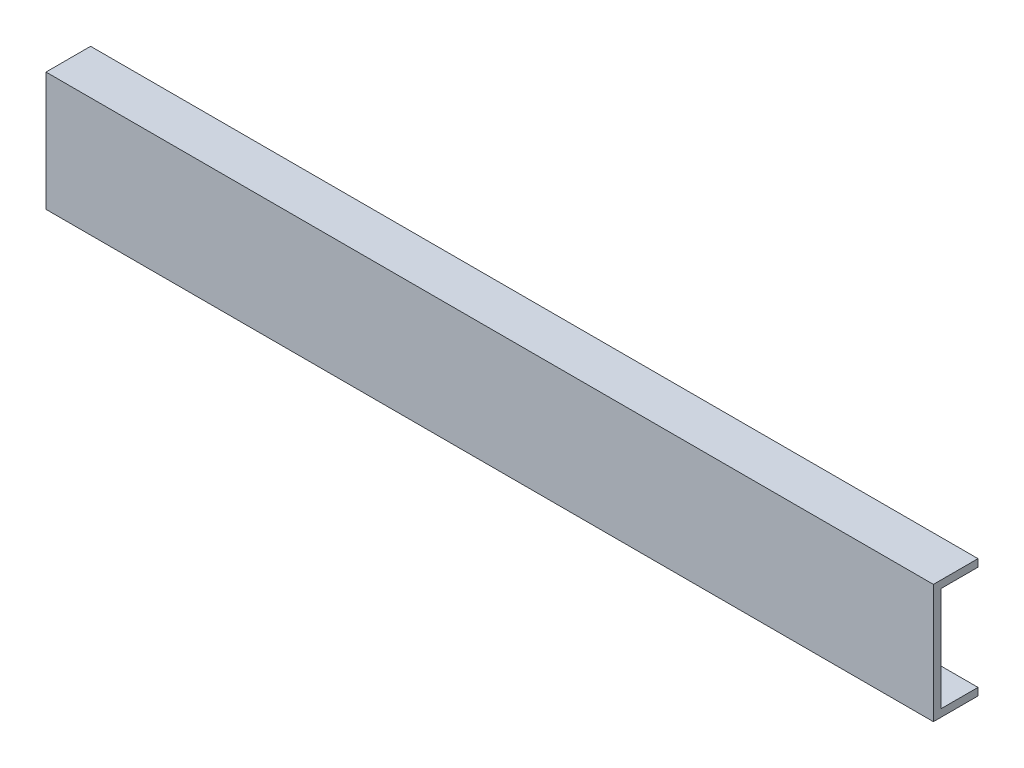
ISO-10303-21;
HEADER;
FILE_DESCRIPTION(('STEP AP214'),'2;1');
FILE_NAME('part.step','',(''),(''),'','','');
FILE_SCHEMA(('AUTOMOTIVE_DESIGN { 1 0 10303 214 1 1 1 1 }'));
ENDSEC;
DATA;
#1=APPLICATION_CONTEXT('core data for automotive mechanical design processes');
#2=APPLICATION_PROTOCOL_DEFINITION('international standard','automotive_design',2000,#1);
#3=PRODUCT_CONTEXT('',#1,'mechanical');
#4=PRODUCT('Part','Part','',(#3));
#5=PRODUCT_RELATED_PRODUCT_CATEGORY('part','',(#4));
#6=PRODUCT_DEFINITION_FORMATION('','',#4);
#7=PRODUCT_DEFINITION_CONTEXT('part definition',#1,'design');
#8=PRODUCT_DEFINITION('design','',#6,#7);
#9=PRODUCT_DEFINITION_SHAPE('','',#8);
#10=(LENGTH_UNIT() NAMED_UNIT(*) SI_UNIT(.MILLI.,.METRE.));
#11=(NAMED_UNIT(*) PLANE_ANGLE_UNIT() SI_UNIT($,.RADIAN.));
#12=(NAMED_UNIT(*) SI_UNIT($,.STERADIAN.) SOLID_ANGLE_UNIT());
#13=UNCERTAINTY_MEASURE_WITH_UNIT(LENGTH_MEASURE(1.E-05),#10,'distance_accuracy_value','');
#14=(GEOMETRIC_REPRESENTATION_CONTEXT(3) GLOBAL_UNCERTAINTY_ASSIGNED_CONTEXT((#13)) GLOBAL_UNIT_ASSIGNED_CONTEXT((#10,
#11,#12)) REPRESENTATION_CONTEXT('',''));
#15=CARTESIAN_POINT('',(0.,0.,0.));
#16=DIRECTION('',(0.,0.,1.));
#17=DIRECTION('',(1.,0.,0.));
#18=AXIS2_PLACEMENT_3D('',#15,#16,#17);
#19=CARTESIAN_POINT('',(596.9,-14.1624110638169,0.));
#20=DIRECTION('',(0.,0.,-1.));
#21=DIRECTION('',(-1.,0.,0.));
#22=AXIS2_PLACEMENT_3D('',#19,#20,#21);
#23=PLANE('',#22);
#24=DIRECTION('',(0.,-1.,0.));
#25=VECTOR('',#24,1.);
#26=CARTESIAN_POINT('',(0.,-14.1624110638169,0.));
#27=LINE('',#26,#25);
#28=CARTESIAN_POINT('',(0.,65.8375889361832,0.));
#29=VERTEX_POINT('',#28);
#30=CARTESIAN_POINT('',(0.,-14.1624110638169,0.));
#31=VERTEX_POINT('',#30);
#32=EDGE_CURVE('E129',#29,#31,#27,.T.);
#33=ORIENTED_EDGE('',*,*,#32,.T.);
#34=DIRECTION('',(-1.,0.,0.));
#35=VECTOR('',#34,1.);
#36=CARTESIAN_POINT('',(596.9,-14.1624110638169,0.));
#37=LINE('',#36,#35);
#38=CARTESIAN_POINT('',(596.9,-14.1624110638169,0.));
#39=VERTEX_POINT('',#38);
#40=EDGE_CURVE('E11',#39,#31,#37,.T.);
#41=ORIENTED_EDGE('',*,*,#40,.F.);
#42=DIRECTION('',(0.,-1.,0.));
#43=VECTOR('',#42,1.);
#44=CARTESIAN_POINT('',(596.9,-14.1624110638169,0.));
#45=LINE('',#44,#43);
#46=CARTESIAN_POINT('',(596.9,65.8375889361832,0.));
#47=VERTEX_POINT('',#46);
#48=EDGE_CURVE('E143',#47,#39,#45,.T.);
#49=ORIENTED_EDGE('',*,*,#48,.F.);
#50=DIRECTION('',(-1.,0.,0.));
#51=VECTOR('',#50,1.);
#52=CARTESIAN_POINT('',(596.9,65.8375889361832,0.));
#53=LINE('',#52,#51);
#54=EDGE_CURVE('E125',#47,#29,#53,.T.);
#55=ORIENTED_EDGE('',*,*,#54,.T.);
#56=EDGE_LOOP('',(#33,#41,#49,#55));
#57=FACE_BOUND('',#56,.T.);
#58=ADVANCED_FACE('F33',(#57),#23,.F.);
#59=CARTESIAN_POINT('',(596.9,-14.1624110638169,-30.));
#60=DIRECTION('',(0.,1.,0.));
#61=DIRECTION('',(0.,0.,1.));
#62=AXIS2_PLACEMENT_3D('',#59,#60,#61);
#63=PLANE('',#62);
#64=DIRECTION('',(0.,0.,-1.));
#65=VECTOR('',#64,1.);
#66=CARTESIAN_POINT('',(0.,-14.1624110638169,-30.));
#67=LINE('',#66,#65);
#68=CARTESIAN_POINT('',(0.,-14.1624110638169,-30.));
#69=VERTEX_POINT('',#68);
#70=EDGE_CURVE('E132',#31,#69,#67,.T.);
#71=ORIENTED_EDGE('',*,*,#70,.T.);
#72=DIRECTION('',(-1.,0.,0.));
#73=VECTOR('',#72,1.);
#74=CARTESIAN_POINT('',(596.9,-14.1624110638169,-30.));
#75=LINE('',#74,#73);
#76=CARTESIAN_POINT('',(596.9,-14.1624110638169,-30.));
#77=VERTEX_POINT('',#76);
#78=EDGE_CURVE('E41',#77,#69,#75,.T.);
#79=ORIENTED_EDGE('',*,*,#78,.F.);
#80=DIRECTION('',(0.,0.,-1.));
#81=VECTOR('',#80,1.);
#82=CARTESIAN_POINT('',(596.9,-14.1624110638169,-30.));
#83=LINE('',#82,#81);
#84=EDGE_CURVE('E92',#39,#77,#83,.T.);
#85=ORIENTED_EDGE('',*,*,#84,.F.);
#86=ORIENTED_EDGE('',*,*,#40,.T.);
#87=EDGE_LOOP('',(#71,#79,#85,#86));
#88=FACE_BOUND('',#87,.T.);
#89=ADVANCED_FACE('F178',(#88),#63,.F.);
#90=CARTESIAN_POINT('',(596.9,-9.16241106381685,-30.));
#91=DIRECTION('',(0.,0.,1.));
#92=DIRECTION('',(0.,-1.,0.));
#93=AXIS2_PLACEMENT_3D('',#90,#91,#92);
#94=PLANE('',#93);
#95=DIRECTION('',(0.,1.,0.));
#96=VECTOR('',#95,1.);
#97=CARTESIAN_POINT('',(0.,-9.16241106381685,-30.));
#98=LINE('',#97,#96);
#99=CARTESIAN_POINT('',(0.,-9.16241106381685,-30.));
#100=VERTEX_POINT('',#99);
#101=EDGE_CURVE('E134',#69,#100,#98,.T.);
#102=ORIENTED_EDGE('',*,*,#101,.T.);
#103=DIRECTION('',(-1.,0.,0.));
#104=VECTOR('',#103,1.);
#105=CARTESIAN_POINT('',(596.9,-9.16241106381685,-30.));
#106=LINE('',#105,#104);
#107=CARTESIAN_POINT('',(596.9,-9.16241106381685,-30.));
#108=VERTEX_POINT('',#107);
#109=EDGE_CURVE('E150',#108,#100,#106,.T.);
#110=ORIENTED_EDGE('',*,*,#109,.F.);
#111=DIRECTION('',(0.,1.,0.));
#112=VECTOR('',#111,1.);
#113=CARTESIAN_POINT('',(596.9,-9.16241106381685,-30.));
#114=LINE('',#113,#112);
#115=EDGE_CURVE('E158',#77,#108,#114,.T.);
#116=ORIENTED_EDGE('',*,*,#115,.F.);
#117=ORIENTED_EDGE('',*,*,#78,.T.);
#118=EDGE_LOOP('',(#102,#110,#116,#117));
#119=FACE_BOUND('',#118,.T.);
#120=ADVANCED_FACE('F156',(#119),#94,.F.);
#121=CARTESIAN_POINT('',(596.9,-9.16241106381686,-5.00000000000001));
#122=DIRECTION('',(0.,-1.,0.));
#123=DIRECTION('',(0.,0.,-1.));
#124=AXIS2_PLACEMENT_3D('',#121,#122,#123);
#125=PLANE('',#124);
#126=DIRECTION('',(0.,0.,1.));
#127=VECTOR('',#126,1.);
#128=CARTESIAN_POINT('',(0.,-9.16241106381686,-5.00000000000001));
#129=LINE('',#128,#127);
#130=CARTESIAN_POINT('',(0.,-9.16241106381686,-5.00000000000001));
#131=VERTEX_POINT('',#130);
#132=EDGE_CURVE('E136',#100,#131,#129,.T.);
#133=ORIENTED_EDGE('',*,*,#132,.T.);
#134=DIRECTION('',(-1.,0.,0.));
#135=VECTOR('',#134,1.);
#136=CARTESIAN_POINT('',(596.9,-9.16241106381686,-5.00000000000001));
#137=LINE('',#136,#135);
#138=CARTESIAN_POINT('',(596.9,-9.16241106381686,-5.00000000000001));
#139=VERTEX_POINT('',#138);
#140=EDGE_CURVE('E147',#139,#131,#137,.T.);
#141=ORIENTED_EDGE('',*,*,#140,.F.);
#142=DIRECTION('',(0.,0.,1.));
#143=VECTOR('',#142,1.);
#144=CARTESIAN_POINT('',(596.9,-9.16241106381686,-5.00000000000001));
#145=LINE('',#144,#143);
#146=EDGE_CURVE('E170',#108,#139,#145,.T.);
#147=ORIENTED_EDGE('',*,*,#146,.F.);
#148=ORIENTED_EDGE('',*,*,#109,.T.);
#149=EDGE_LOOP('',(#133,#141,#147,#148));
#150=FACE_BOUND('',#149,.T.);
#151=ADVANCED_FACE('F166',(#150),#125,.F.);
#152=CARTESIAN_POINT('',(596.9,60.8375889361832,-5.));
#153=DIRECTION('',(0.,0.,1.));
#154=DIRECTION('',(0.,-1.,0.));
#155=AXIS2_PLACEMENT_3D('',#152,#153,#154);
#156=PLANE('',#155);
#157=DIRECTION('',(0.,1.,0.));
#158=VECTOR('',#157,1.);
#159=CARTESIAN_POINT('',(0.,60.8375889361832,-5.));
#160=LINE('',#159,#158);
#161=CARTESIAN_POINT('',(0.,60.8375889361832,-5.));
#162=VERTEX_POINT('',#161);
#163=EDGE_CURVE('E138',#131,#162,#160,.T.);
#164=ORIENTED_EDGE('',*,*,#163,.T.);
#165=DIRECTION('',(-1.,0.,0.));
#166=VECTOR('',#165,1.);
#167=CARTESIAN_POINT('',(596.9,60.8375889361832,-5.));
#168=LINE('',#167,#166);
#169=CARTESIAN_POINT('',(596.9,60.8375889361832,-5.));
#170=VERTEX_POINT('',#169);
#171=EDGE_CURVE('E120',#170,#162,#168,.T.);
#172=ORIENTED_EDGE('',*,*,#171,.F.);
#173=DIRECTION('',(0.,1.,0.));
#174=VECTOR('',#173,1.);
#175=CARTESIAN_POINT('',(596.9,60.8375889361832,-5.));
#176=LINE('',#175,#174);
#177=EDGE_CURVE('E111',#139,#170,#176,.T.);
#178=ORIENTED_EDGE('',*,*,#177,.F.);
#179=ORIENTED_EDGE('',*,*,#140,.T.);
#180=EDGE_LOOP('',(#164,#172,#178,#179));
#181=FACE_BOUND('',#180,.T.);
#182=ADVANCED_FACE('F169',(#181),#156,.F.);
#183=CARTESIAN_POINT('',(596.9,60.8375889361832,-30.));
#184=DIRECTION('',(0.,1.,0.));
#185=DIRECTION('',(0.,0.,1.));
#186=AXIS2_PLACEMENT_3D('',#183,#184,#185);
#187=PLANE('',#186);
#188=DIRECTION('',(0.,0.,-1.));
#189=VECTOR('',#188,1.);
#190=CARTESIAN_POINT('',(0.,60.8375889361832,-30.));
#191=LINE('',#190,#189);
#192=CARTESIAN_POINT('',(0.,60.8375889361832,-30.));
#193=VERTEX_POINT('',#192);
#194=EDGE_CURVE('E119',#162,#193,#191,.T.);
#195=ORIENTED_EDGE('',*,*,#194,.T.);
#196=DIRECTION('',(-1.,0.,0.));
#197=VECTOR('',#196,1.);
#198=CARTESIAN_POINT('',(596.9,60.8375889361832,-30.));
#199=LINE('',#198,#197);
#200=CARTESIAN_POINT('',(596.9,60.8375889361832,-30.));
#201=VERTEX_POINT('',#200);
#202=EDGE_CURVE('E116',#201,#193,#199,.T.);
#203=ORIENTED_EDGE('',*,*,#202,.F.);
#204=DIRECTION('',(0.,0.,-1.));
#205=VECTOR('',#204,1.);
#206=CARTESIAN_POINT('',(596.9,60.8375889361832,-30.));
#207=LINE('',#206,#205);
#208=EDGE_CURVE('E105',#170,#201,#207,.T.);
#209=ORIENTED_EDGE('',*,*,#208,.F.);
#210=ORIENTED_EDGE('',*,*,#171,.T.);
#211=EDGE_LOOP('',(#195,#203,#209,#210));
#212=FACE_BOUND('',#211,.T.);
#213=ADVANCED_FACE('F117',(#212),#187,.F.);
#214=CARTESIAN_POINT('',(596.9,65.8375889361832,-30.));
#215=DIRECTION('',(0.,0.,1.));
#216=DIRECTION('',(1.,0.,0.));
#217=AXIS2_PLACEMENT_3D('',#214,#215,#216);
#218=PLANE('',#217);
#219=DIRECTION('',(0.,1.,0.));
#220=VECTOR('',#219,1.);
#221=CARTESIAN_POINT('',(0.,65.8375889361832,-30.));
#222=LINE('',#221,#220);
#223=CARTESIAN_POINT('',(0.,65.8375889361832,-30.));
#224=VERTEX_POINT('',#223);
#225=EDGE_CURVE('E78',#193,#224,#222,.T.);
#226=ORIENTED_EDGE('',*,*,#225,.T.);
#227=DIRECTION('',(-1.,0.,0.));
#228=VECTOR('',#227,1.);
#229=CARTESIAN_POINT('',(596.9,65.8375889361832,-30.));
#230=LINE('',#229,#228);
#231=CARTESIAN_POINT('',(596.9,65.8375889361832,-30.));
#232=VERTEX_POINT('',#231);
#233=EDGE_CURVE('E121',#232,#224,#230,.T.);
#234=ORIENTED_EDGE('',*,*,#233,.F.);
#235=DIRECTION('',(0.,1.,0.));
#236=VECTOR('',#235,1.);
#237=CARTESIAN_POINT('',(596.9,65.8375889361832,-30.));
#238=LINE('',#237,#236);
#239=EDGE_CURVE('E109',#201,#232,#238,.T.);
#240=ORIENTED_EDGE('',*,*,#239,.F.);
#241=ORIENTED_EDGE('',*,*,#202,.T.);
#242=EDGE_LOOP('',(#226,#234,#240,#241));
#243=FACE_BOUND('',#242,.T.);
#244=ADVANCED_FACE('F123',(#243),#218,.F.);
#245=CARTESIAN_POINT('',(596.9,65.8375889361832,0.));
#246=DIRECTION('',(0.,-1.,0.));
#247=DIRECTION('',(0.,0.,-1.));
#248=AXIS2_PLACEMENT_3D('',#245,#246,#247);
#249=PLANE('',#248);
#250=DIRECTION('',(0.,0.,1.));
#251=VECTOR('',#250,1.);
#252=CARTESIAN_POINT('',(0.,65.8375889361832,0.));
#253=LINE('',#252,#251);
#254=EDGE_CURVE('E84',#224,#29,#253,.T.);
#255=ORIENTED_EDGE('',*,*,#254,.T.);
#256=ORIENTED_EDGE('',*,*,#54,.F.);
#257=DIRECTION('',(0.,0.,1.));
#258=VECTOR('',#257,1.);
#259=CARTESIAN_POINT('',(596.9,65.8375889361832,0.));
#260=LINE('',#259,#258);
#261=EDGE_CURVE('E49',#232,#47,#260,.T.);
#262=ORIENTED_EDGE('',*,*,#261,.F.);
#263=ORIENTED_EDGE('',*,*,#233,.T.);
#264=EDGE_LOOP('',(#255,#256,#262,#263));
#265=FACE_BOUND('',#264,.T.);
#266=ADVANCED_FACE('F194',(#265),#249,.F.);
#267=CARTESIAN_POINT('',(596.9,0.,0.));
#268=DIRECTION('',(-1.,0.,0.));
#269=DIRECTION('',(0.,0.,1.));
#270=AXIS2_PLACEMENT_3D('',#267,#268,#269);
#271=PLANE('',#270);
#272=ORIENTED_EDGE('',*,*,#48,.T.);
#273=ORIENTED_EDGE('',*,*,#84,.T.);
#274=ORIENTED_EDGE('',*,*,#115,.T.);
#275=ORIENTED_EDGE('',*,*,#146,.T.);
#276=ORIENTED_EDGE('',*,*,#177,.T.);
#277=ORIENTED_EDGE('',*,*,#208,.T.);
#278=ORIENTED_EDGE('',*,*,#239,.T.);
#279=ORIENTED_EDGE('',*,*,#261,.T.);
#280=EDGE_LOOP('',(#272,#273,#274,#275,#276,#277,#278,#279));
#281=FACE_BOUND('',#280,.T.);
#282=ADVANCED_FACE('F107',(#281),#271,.F.);
#283=CARTESIAN_POINT('',(0.,0.,0.));
#284=DIRECTION('',(-1.,0.,0.));
#285=DIRECTION('',(0.,0.,1.));
#286=AXIS2_PLACEMENT_3D('',#283,#284,#285);
#287=PLANE('',#286);
#288=ORIENTED_EDGE('',*,*,#32,.F.);
#289=ORIENTED_EDGE('',*,*,#254,.F.);
#290=ORIENTED_EDGE('',*,*,#225,.F.);
#291=ORIENTED_EDGE('',*,*,#194,.F.);
#292=ORIENTED_EDGE('',*,*,#163,.F.);
#293=ORIENTED_EDGE('',*,*,#132,.F.);
#294=ORIENTED_EDGE('',*,*,#101,.F.);
#295=ORIENTED_EDGE('',*,*,#70,.F.);
#296=EDGE_LOOP('',(#288,#289,#290,#291,#292,#293,#294,#295));
#297=FACE_BOUND('',#296,.T.);
#298=ADVANCED_FACE('F162',(#297),#287,.T.);
#299=CLOSED_SHELL('',(#58,#89,#120,#151,#182,#213,#244,#266,#282,#298));
#300=MANIFOLD_SOLID_BREP('B2',#299);
#301=ADVANCED_BREP_SHAPE_REPRESENTATION('',(#18,#300),#14);
#302=SHAPE_DEFINITION_REPRESENTATION(#9,#301);
ENDSEC;
END-ISO-10303-21;
